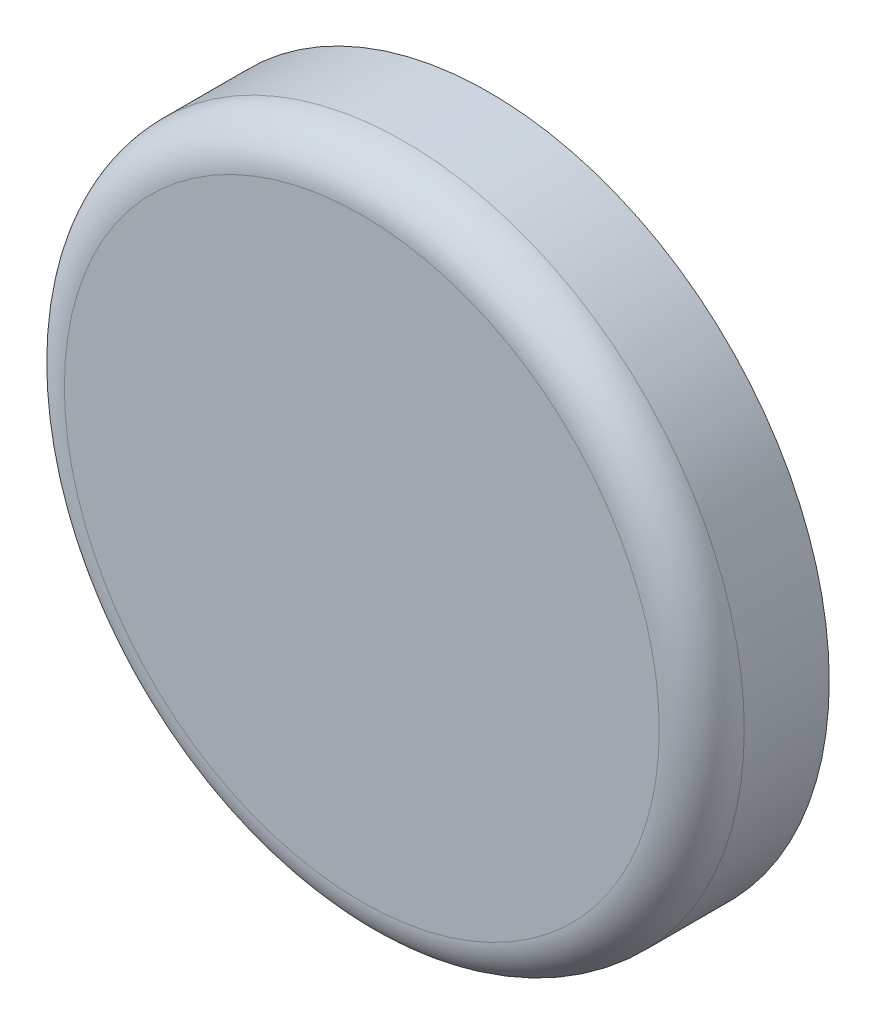
ISO-10303-21;
HEADER;
FILE_DESCRIPTION(('STEP AP214'),'2;1');
FILE_NAME('part.step','',(''),(''),'','','');
FILE_SCHEMA(('AUTOMOTIVE_DESIGN { 1 0 10303 214 1 1 1 1 }'));
ENDSEC;
DATA;
#1=APPLICATION_CONTEXT('core data for automotive mechanical design processes');
#2=APPLICATION_PROTOCOL_DEFINITION('international standard','automotive_design',2000,#1);
#3=PRODUCT_CONTEXT('',#1,'mechanical');
#4=PRODUCT('Part','Part','',(#3));
#5=PRODUCT_RELATED_PRODUCT_CATEGORY('part','',(#4));
#6=PRODUCT_DEFINITION_FORMATION('','',#4);
#7=PRODUCT_DEFINITION_CONTEXT('part definition',#1,'design');
#8=PRODUCT_DEFINITION('design','',#6,#7);
#9=PRODUCT_DEFINITION_SHAPE('','',#8);
#10=(LENGTH_UNIT() NAMED_UNIT(*) SI_UNIT(.MILLI.,.METRE.));
#11=(NAMED_UNIT(*) PLANE_ANGLE_UNIT() SI_UNIT($,.RADIAN.));
#12=(NAMED_UNIT(*) SI_UNIT($,.STERADIAN.) SOLID_ANGLE_UNIT());
#13=UNCERTAINTY_MEASURE_WITH_UNIT(LENGTH_MEASURE(1.E-05),#10,'distance_accuracy_value','');
#14=(GEOMETRIC_REPRESENTATION_CONTEXT(3) GLOBAL_UNCERTAINTY_ASSIGNED_CONTEXT((#13)) GLOBAL_UNIT_ASSIGNED_CONTEXT((#10,
#11,#12)) REPRESENTATION_CONTEXT('',''));
#15=CARTESIAN_POINT('',(0.,0.,0.));
#16=DIRECTION('',(0.,0.,1.));
#17=DIRECTION('',(1.,0.,0.));
#18=AXIS2_PLACEMENT_3D('',#15,#16,#17);
#19=CARTESIAN_POINT('',(0.,0.,22.6126937969864));
#20=DIRECTION('',(0.,0.,-1.));
#21=DIRECTION('',(-1.,0.,0.));
#22=AXIS2_PLACEMENT_3D('',#19,#20,#21);
#23=CYLINDRICAL_SURFACE('',#22,80.);
#24=CARTESIAN_POINT('',(0.,0.,12.6126937969864));
#25=DIRECTION('',(0.,0.,1.));
#26=DIRECTION('',(1.,0.,0.));
#27=AXIS2_PLACEMENT_3D('',#24,#25,#26);
#28=CIRCLE('',#27,80.);
#29=CARTESIAN_POINT('',(80.,0.,12.6126937969864));
#30=VERTEX_POINT('',#29);
#31=EDGE_CURVE('E10',#30,#30,#28,.F.);
#32=ORIENTED_EDGE('',*,*,#31,.T.);
#33=EDGE_LOOP('',(#32));
#34=FACE_BOUND('',#33,.T.);
#35=CARTESIAN_POINT('',(0.,0.,-7.38730620301363));
#36=DIRECTION('',(0.,0.,1.));
#37=DIRECTION('',(1.,0.,0.));
#38=AXIS2_PLACEMENT_3D('',#35,#36,#37);
#39=CIRCLE('',#38,80.);
#40=CARTESIAN_POINT('',(80.,0.,-7.38730620301363));
#41=VERTEX_POINT('',#40);
#42=EDGE_CURVE('E52',#41,#41,#39,.T.);
#43=ORIENTED_EDGE('',*,*,#42,.T.);
#44=EDGE_LOOP('',(#43));
#45=FACE_BOUND('',#44,.T.);
#46=ADVANCED_FACE('F41',(#34,#45),#23,.T.);
#47=CARTESIAN_POINT('',(0.,0.,22.6126937969864));
#48=DIRECTION('',(0.,0.,1.));
#49=DIRECTION('',(1.,0.,0.));
#50=AXIS2_PLACEMENT_3D('',#47,#48,#49);
#51=PLANE('',#50);
#52=CARTESIAN_POINT('',(0.,0.,22.6126937969864));
#53=DIRECTION('',(0.,0.,1.));
#54=DIRECTION('',(1.,0.,0.));
#55=AXIS2_PLACEMENT_3D('',#52,#53,#54);
#56=CIRCLE('',#55,70.);
#57=CARTESIAN_POINT('',(70.,0.,22.6126937969864));
#58=VERTEX_POINT('',#57);
#59=EDGE_CURVE('E48',#58,#58,#56,.T.);
#60=ORIENTED_EDGE('',*,*,#59,.T.);
#61=EDGE_LOOP('',(#60));
#62=FACE_BOUND('',#61,.T.);
#63=ADVANCED_FACE('F62',(#62),#51,.T.);
#64=CARTESIAN_POINT('',(0.,0.,-7.38730620301363));
#65=DIRECTION('',(0.,0.,1.));
#66=DIRECTION('',(1.,0.,0.));
#67=AXIS2_PLACEMENT_3D('',#64,#65,#66);
#68=PLANE('',#67);
#69=ORIENTED_EDGE('',*,*,#42,.F.);
#70=EDGE_LOOP('',(#69));
#71=FACE_BOUND('',#70,.T.);
#72=ADVANCED_FACE('F60',(#71),#68,.F.);
#73=CARTESIAN_POINT('',(0.,0.,12.6126937969864));
#74=DIRECTION('',(0.,0.,1.));
#75=DIRECTION('',(1.,0.,0.));
#76=AXIS2_PLACEMENT_3D('',#73,#74,#75);
#77=TOROIDAL_SURFACE('',#76,70.,10.);
#78=ORIENTED_EDGE('',*,*,#31,.F.);
#79=EDGE_LOOP('',(#78));
#80=FACE_BOUND('',#79,.T.);
#81=ORIENTED_EDGE('',*,*,#59,.F.);
#82=EDGE_LOOP('',(#81));
#83=FACE_BOUND('',#82,.T.);
#84=ADVANCED_FACE('F43',(#80,#83),#77,.T.);
#85=CLOSED_SHELL('',(#46,#63,#72,#84));
#86=MANIFOLD_SOLID_BREP('B2',#85);
#87=ADVANCED_BREP_SHAPE_REPRESENTATION('',(#18,#86),#14);
#88=SHAPE_DEFINITION_REPRESENTATION(#9,#87);
ENDSEC;
END-ISO-10303-21;
